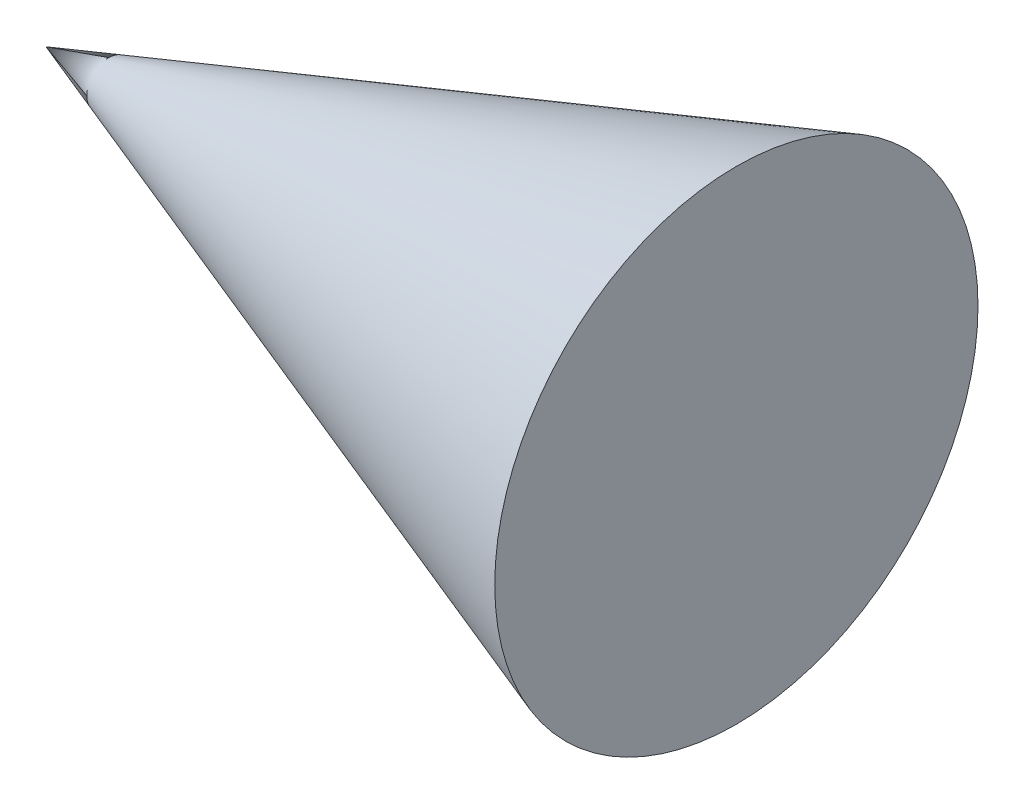
ISO-10303-21;
HEADER;
FILE_DESCRIPTION(('STEP AP214'),'2;1');
FILE_NAME('part.step','',(''),(''),'','','');
FILE_SCHEMA(('AUTOMOTIVE_DESIGN { 1 0 10303 214 1 1 1 1 }'));
ENDSEC;
DATA;
#1=APPLICATION_CONTEXT('core data for automotive mechanical design processes');
#2=APPLICATION_PROTOCOL_DEFINITION('international standard','automotive_design',2000,#1);
#3=PRODUCT_CONTEXT('',#1,'mechanical');
#4=PRODUCT('Part','Part','',(#3));
#5=PRODUCT_RELATED_PRODUCT_CATEGORY('part','',(#4));
#6=PRODUCT_DEFINITION_FORMATION('','',#4);
#7=PRODUCT_DEFINITION_CONTEXT('part definition',#1,'design');
#8=PRODUCT_DEFINITION('design','',#6,#7);
#9=PRODUCT_DEFINITION_SHAPE('','',#8);
#10=(LENGTH_UNIT() NAMED_UNIT(*) SI_UNIT(.MILLI.,.METRE.));
#11=(NAMED_UNIT(*) PLANE_ANGLE_UNIT() SI_UNIT($,.RADIAN.));
#12=(NAMED_UNIT(*) SI_UNIT($,.STERADIAN.) SOLID_ANGLE_UNIT());
#13=UNCERTAINTY_MEASURE_WITH_UNIT(LENGTH_MEASURE(1.E-05),#10,'distance_accuracy_value','');
#14=(GEOMETRIC_REPRESENTATION_CONTEXT(3) GLOBAL_UNCERTAINTY_ASSIGNED_CONTEXT((#13)) GLOBAL_UNIT_ASSIGNED_CONTEXT((#10,
#11,#12)) REPRESENTATION_CONTEXT('',''));
#15=CARTESIAN_POINT('',(0.,0.,0.));
#16=DIRECTION('',(0.,0.,1.));
#17=DIRECTION('',(1.,0.,0.));
#18=AXIS2_PLACEMENT_3D('',#15,#16,#17);
#19=CARTESIAN_POINT('',(20.,0.,0.));
#20=DIRECTION('',(-1.,0.,0.));
#21=DIRECTION('',(0.,0.,1.));
#22=AXIS2_PLACEMENT_3D('',#19,#20,#21);
#23=PLANE('',#22);
#24=CARTESIAN_POINT('',(20.,0.,0.));
#25=DIRECTION('',(-1.,0.,0.));
#26=DIRECTION('',(0.,0.,1.));
#27=AXIS2_PLACEMENT_3D('',#24,#25,#26);
#28=CIRCLE('',#27,7.);
#29=CARTESIAN_POINT('',(20.,0.,7.));
#30=VERTEX_POINT('',#29);
#31=EDGE_CURVE('E11',#30,#30,#28,.T.);
#32=ORIENTED_EDGE('',*,*,#31,.F.);
#33=EDGE_LOOP('',(#32));
#34=FACE_BOUND('',#33,.T.);
#35=ADVANCED_FACE('F43',(#34),#23,.F.);
#36=CARTESIAN_POINT('',(20.,0.,0.));
#37=DIRECTION('',(1.,0.,0.));
#38=DIRECTION('',(0.,0.,-1.));
#39=AXIS2_PLACEMENT_3D('',#36,#37,#38);
#40=CONICAL_SURFACE('',#39,7.,0.336674819386727);
#41=CARTESIAN_POINT('',(0.,0.,0.));
#42=VERTEX_POINT('',#41);
#43=VERTEX_LOOP('',#42);
#44=FACE_BOUND('',#43,.T.);
#45=ORIENTED_EDGE('',*,*,#31,.T.);
#46=EDGE_LOOP('',(#45));
#47=FACE_BOUND('',#46,.T.);
#48=ADVANCED_FACE('F51',(#44,#47),#40,.T.);
#49=CLOSED_SHELL('',(#35,#48));
#50=MANIFOLD_SOLID_BREP('B2',#49);
#51=ADVANCED_BREP_SHAPE_REPRESENTATION('',(#18,#50),#14);
#52=SHAPE_DEFINITION_REPRESENTATION(#9,#51);
ENDSEC;
END-ISO-10303-21;
